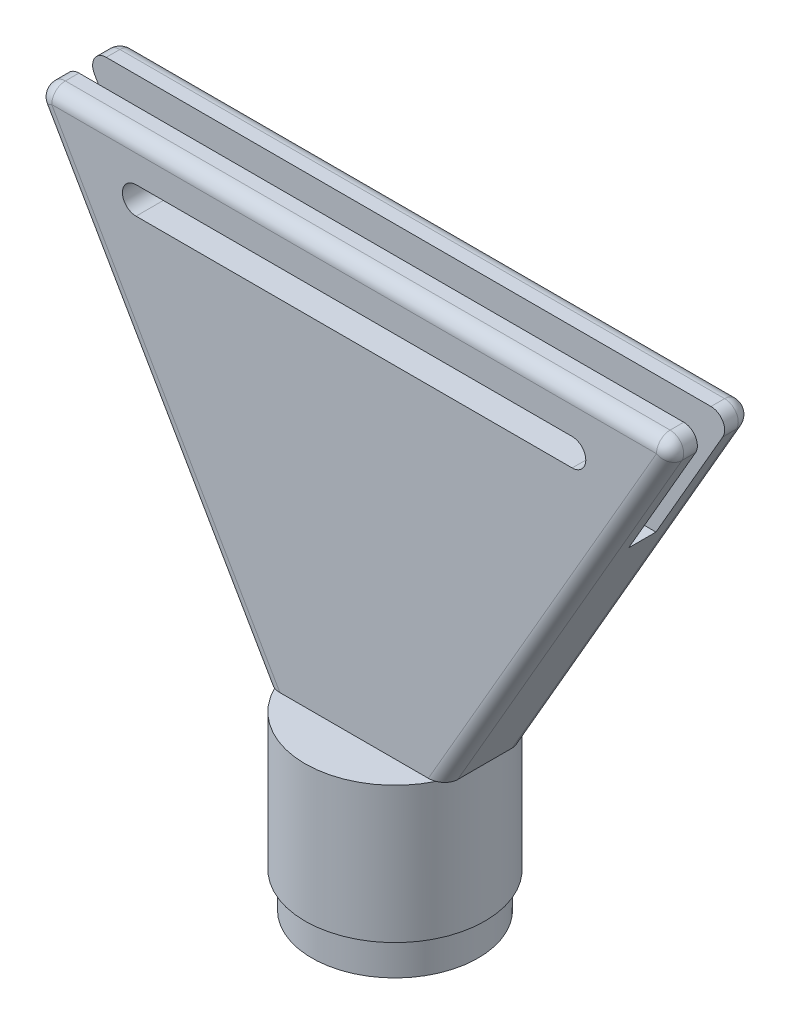
ISO-10303-21;
HEADER;
FILE_DESCRIPTION(('STEP AP214'),'2;1');
FILE_NAME('part.step','',(''),(''),'','','');
FILE_SCHEMA(('AUTOMOTIVE_DESIGN { 1 0 10303 214 1 1 1 1 }'));
ENDSEC;
DATA;
#1=APPLICATION_CONTEXT('core data for automotive mechanical design processes');
#2=APPLICATION_PROTOCOL_DEFINITION('international standard','automotive_design',2000,#1);
#3=PRODUCT_CONTEXT('',#1,'mechanical');
#4=PRODUCT('Part','Part','',(#3));
#5=PRODUCT_RELATED_PRODUCT_CATEGORY('part','',(#4));
#6=PRODUCT_DEFINITION_FORMATION('','',#4);
#7=PRODUCT_DEFINITION_CONTEXT('part definition',#1,'design');
#8=PRODUCT_DEFINITION('design','',#6,#7);
#9=PRODUCT_DEFINITION_SHAPE('','',#8);
#10=(LENGTH_UNIT() NAMED_UNIT(*) SI_UNIT(.MILLI.,.METRE.));
#11=(NAMED_UNIT(*) PLANE_ANGLE_UNIT() SI_UNIT($,.RADIAN.));
#12=(NAMED_UNIT(*) SI_UNIT($,.STERADIAN.) SOLID_ANGLE_UNIT());
#13=UNCERTAINTY_MEASURE_WITH_UNIT(LENGTH_MEASURE(1.E-05),#10,'distance_accuracy_value','');
#14=(GEOMETRIC_REPRESENTATION_CONTEXT(3) GLOBAL_UNCERTAINTY_ASSIGNED_CONTEXT((#13)) GLOBAL_UNIT_ASSIGNED_CONTEXT((#10,
#11,#12)) REPRESENTATION_CONTEXT('',''));
#15=CARTESIAN_POINT('',(0.,0.,0.));
#16=DIRECTION('',(0.,0.,1.));
#17=DIRECTION('',(1.,0.,0.));
#18=AXIS2_PLACEMENT_3D('',#15,#16,#17);
#19=CARTESIAN_POINT('',(60.7580905122492,108.204,7.62));
#20=DIRECTION('',(0.,-1.,0.));
#21=DIRECTION('',(0.,0.,-1.));
#22=AXIS2_PLACEMENT_3D('',#19,#20,#21);
#23=PLANE('',#22);
#24=DIRECTION('',(0.,0.,-1.));
#25=VECTOR('',#24,1.);
#26=CARTESIAN_POINT('',(56.3586814610243,108.204,7.62));
#27=LINE('',#26,#25);
#28=CARTESIAN_POINT('',(56.3586814610243,108.204,5.08));
#29=VERTEX_POINT('',#28);
#30=CARTESIAN_POINT('',(56.3586814610243,108.204,2.54));
#31=VERTEX_POINT('',#30);
#32=EDGE_CURVE('E332',#29,#31,#27,.T.);
#33=ORIENTED_EDGE('',*,*,#32,.T.);
#34=DIRECTION('',(1.,0.,0.));
#35=VECTOR('',#34,1.);
#36=CARTESIAN_POINT('',(-58.8986814610243,108.204,2.54));
#37=LINE('',#36,#35);
#38=CARTESIAN_POINT('',(-56.3586814610243,108.204,2.54));
#39=VERTEX_POINT('',#38);
#40=EDGE_CURVE('E273',#39,#31,#37,.T.);
#41=ORIENTED_EDGE('',*,*,#40,.F.);
#42=DIRECTION('',(0.,0.,-1.));
#43=VECTOR('',#42,1.);
#44=CARTESIAN_POINT('',(-56.3586814610243,108.204,7.62));
#45=LINE('',#44,#43);
#46=CARTESIAN_POINT('',(-56.3586814610243,108.204,5.08));
#47=VERTEX_POINT('',#46);
#48=EDGE_CURVE('E327',#39,#47,#45,.F.);
#49=ORIENTED_EDGE('',*,*,#48,.T.);
#50=DIRECTION('',(-1.,0.,0.));
#51=VECTOR('',#50,1.);
#52=CARTESIAN_POINT('',(60.7580905122492,108.204,5.08));
#53=LINE('',#52,#51);
#54=EDGE_CURVE('E335',#47,#29,#53,.F.);
#55=ORIENTED_EDGE('',*,*,#54,.T.);
#56=EDGE_LOOP('',(#33,#41,#49,#55));
#57=FACE_BOUND('',#56,.T.);
#58=ADVANCED_FACE('F34',(#57),#23,.F.);
#59=CARTESIAN_POINT('',(-56.3586814610243,105.664,7.62));
#60=DIRECTION('',(0.,0.,-1.));
#61=DIRECTION('',(-1.,0.,0.));
#62=AXIS2_PLACEMENT_3D('',#59,#60,#61);
#63=CYLINDRICAL_SURFACE('',#62,2.54);
#64=CARTESIAN_POINT('',(-56.3586814610243,105.664,2.54));
#65=DIRECTION('',(0.,0.,1.));
#66=DIRECTION('',(1.,0.,0.));
#67=AXIS2_PLACEMENT_3D('',#64,#65,#66);
#68=CIRCLE('',#67,2.54);
#69=CARTESIAN_POINT('',(-58.5583859866368,104.394,2.54));
#70=VERTEX_POINT('',#69);
#71=EDGE_CURVE('E289',#70,#39,#68,.F.);
#72=ORIENTED_EDGE('',*,*,#71,.F.);
#73=DIRECTION('',(0.,0.,-1.));
#74=VECTOR('',#73,1.);
#75=CARTESIAN_POINT('',(-58.5583859866368,104.394,7.62));
#76=LINE('',#75,#74);
#77=CARTESIAN_POINT('',(-58.5583859866368,104.394,5.08));
#78=VERTEX_POINT('',#77);
#79=EDGE_CURVE('E348',#78,#70,#76,.T.);
#80=ORIENTED_EDGE('',*,*,#79,.F.);
#81=CARTESIAN_POINT('',(-56.3586814610243,105.664,5.08));
#82=DIRECTION('',(0.,0.,1.));
#83=DIRECTION('',(1.,0.,0.));
#84=AXIS2_PLACEMENT_3D('',#81,#82,#83);
#85=CIRCLE('',#84,2.54);
#86=EDGE_CURVE('E415',#47,#78,#85,.T.);
#87=ORIENTED_EDGE('',*,*,#86,.F.);
#88=ORIENTED_EDGE('',*,*,#48,.F.);
#89=EDGE_LOOP('',(#72,#80,#87,#88));
#90=FACE_BOUND('',#89,.T.);
#91=ADVANCED_FACE('F449',(#90),#63,.T.);
#92=CARTESIAN_POINT('',(56.3586814610243,105.664,7.62));
#93=DIRECTION('',(0.,0.,-1.));
#94=DIRECTION('',(-1.,0.,0.));
#95=AXIS2_PLACEMENT_3D('',#92,#93,#94);
#96=CYLINDRICAL_SURFACE('',#95,2.54);
#97=DIRECTION('',(0.,0.,-1.));
#98=VECTOR('',#97,1.);
#99=CARTESIAN_POINT('',(58.5583859866368,104.394,7.62));
#100=LINE('',#99,#98);
#101=CARTESIAN_POINT('',(58.5583859866368,104.394,2.54));
#102=VERTEX_POINT('',#101);
#103=CARTESIAN_POINT('',(58.5583859866368,104.394,5.08));
#104=VERTEX_POINT('',#103);
#105=EDGE_CURVE('E339',#102,#104,#100,.F.);
#106=ORIENTED_EDGE('',*,*,#105,.F.);
#107=CARTESIAN_POINT('',(56.3586814610243,105.664,2.54));
#108=DIRECTION('',(0.,0.,1.));
#109=DIRECTION('',(1.,0.,0.));
#110=AXIS2_PLACEMENT_3D('',#107,#108,#109);
#111=CIRCLE('',#110,2.54);
#112=EDGE_CURVE('E422',#31,#102,#111,.F.);
#113=ORIENTED_EDGE('',*,*,#112,.F.);
#114=ORIENTED_EDGE('',*,*,#32,.F.);
#115=CARTESIAN_POINT('',(56.3586814610243,105.664,5.08));
#116=DIRECTION('',(0.,0.,1.));
#117=DIRECTION('',(1.,0.,0.));
#118=AXIS2_PLACEMENT_3D('',#115,#116,#117);
#119=CIRCLE('',#118,2.54);
#120=EDGE_CURVE('E388',#29,#104,#119,.F.);
#121=ORIENTED_EDGE('',*,*,#120,.T.);
#122=EDGE_LOOP('',(#106,#113,#114,#121));
#123=FACE_BOUND('',#122,.T.);
#124=ADVANCED_FACE('F456',(#123),#96,.T.);
#125=CARTESIAN_POINT('',(0.,32.004,0.));
#126=DIRECTION('',(0.,1.,0.));
#127=DIRECTION('',(0.,0.,1.));
#128=AXIS2_PLACEMENT_3D('',#125,#126,#127);
#129=PLANE('',#128);
#130=CARTESIAN_POINT('',(0.,32.004,0.));
#131=DIRECTION('',(0.,1.,0.));
#132=DIRECTION('',(0.,0.,1.));
#133=AXIS2_PLACEMENT_3D('',#130,#131,#132);
#134=CIRCLE('',#133,16.764);
#135=CARTESIAN_POINT('',(15.0464319536251,32.004,-7.39165620581253));
#136=VERTEX_POINT('',#135);
#137=CARTESIAN_POINT('',(-15.0464319536246,32.004,-7.39165620581371));
#138=VERTEX_POINT('',#137);
#139=EDGE_CURVE('E501',#136,#138,#134,.T.);
#140=ORIENTED_EDGE('',*,*,#139,.T.);
#141=CARTESIAN_POINT('',(-13.8310606325167,32.004,-5.08));
#142=DIRECTION('',(0.,1.,0.));
#143=DIRECTION('',(1.,0.,0.));
#144=AXIS2_PLACEMENT_3D('',#141,#142,#143);
#145=ELLIPSE('',#144,2.93293936748329,2.54);
#146=CARTESIAN_POINT('',(-13.8310606325167,32.004,-7.62));
#147=VERTEX_POINT('',#146);
#148=EDGE_CURVE('E378',#138,#147,#145,.F.);
#149=ORIENTED_EDGE('',*,*,#148,.T.);
#150=DIRECTION('',(1.,0.,0.));
#151=VECTOR('',#150,1.);
#152=CARTESIAN_POINT('',(-16.764,32.004,-7.62));
#153=LINE('',#152,#151);
#154=CARTESIAN_POINT('',(13.8310606325167,32.004,-7.62));
#155=VERTEX_POINT('',#154);
#156=EDGE_CURVE('E300',#147,#155,#153,.T.);
#157=ORIENTED_EDGE('',*,*,#156,.T.);
#158=CARTESIAN_POINT('',(13.8310606325167,32.004,-5.08));
#159=DIRECTION('',(0.,1.,0.));
#160=DIRECTION('',(1.,0.,0.));
#161=AXIS2_PLACEMENT_3D('',#158,#159,#160);
#162=ELLIPSE('',#161,2.93293936748329,2.54);
#163=EDGE_CURVE('E382',#155,#136,#162,.F.);
#164=ORIENTED_EDGE('',*,*,#163,.T.);
#165=EDGE_LOOP('',(#140,#149,#157,#164));
#166=FACE_BOUND('',#165,.T.);
#167=ADVANCED_FACE('F500',(#166),#129,.T.);
#168=CARTESIAN_POINT('',(0.,6.604,0.));
#169=DIRECTION('',(0.,-1.,0.));
#170=DIRECTION('',(0.,0.,-1.));
#171=AXIS2_PLACEMENT_3D('',#168,#169,#170);
#172=CYLINDRICAL_SURFACE('',#171,15.494);
#173=CARTESIAN_POINT('',(0.,6.604,0.));
#174=DIRECTION('',(0.,1.,0.));
#175=DIRECTION('',(0.,0.,1.));
#176=AXIS2_PLACEMENT_3D('',#173,#174,#175);
#177=CIRCLE('',#176,15.494);
#178=CARTESIAN_POINT('',(0.,6.604,-15.494));
#179=VERTEX_POINT('',#178);
#180=EDGE_CURVE('E301',#179,#179,#177,.T.);
#181=CARTESIAN_POINT('',(0.,0.,0.));
#182=DIRECTION('',(0.,1.,0.));
#183=DIRECTION('',(0.,0.,1.));
#184=AXIS2_PLACEMENT_3D('',#181,#182,#183);
#185=CIRCLE('',#184,15.494);
#186=CARTESIAN_POINT('',(0.,0.,-15.494));
#187=VERTEX_POINT('',#186);
#188=EDGE_CURVE('E316',#187,#187,#185,.T.);
#189=CARTESIAN_POINT('',(0.,6.604,-15.494));
#190=CARTESIAN_POINT('',(0.,6.53520833333333,-15.494));
#191=CARTESIAN_POINT('',(0.,6.46641666666667,-15.494));
#192=CARTESIAN_POINT('',(0.,6.32883333333333,-15.494));
#193=CARTESIAN_POINT('',(0.,6.26004166666667,-15.494));
#194=CARTESIAN_POINT('',(0.,6.12245833333333,-15.494));
#195=CARTESIAN_POINT('',(0.,6.05366666666667,-15.494));
#196=CARTESIAN_POINT('',(0.,5.91608333333333,-15.494));
#197=CARTESIAN_POINT('',(0.,5.84729166666667,-15.494));
#198=CARTESIAN_POINT('',(0.,5.70970833333333,-15.494));
#199=CARTESIAN_POINT('',(0.,5.64091666666667,-15.494));
#200=CARTESIAN_POINT('',(0.,5.50333333333333,-15.494));
#201=CARTESIAN_POINT('',(0.,5.43454166666667,-15.494));
#202=CARTESIAN_POINT('',(0.,5.29695833333333,-15.494));
#203=CARTESIAN_POINT('',(0.,5.22816666666667,-15.494));
#204=CARTESIAN_POINT('',(0.,5.09058333333333,-15.494));
#205=CARTESIAN_POINT('',(0.,5.02179166666667,-15.494));
#206=CARTESIAN_POINT('',(0.,4.88420833333333,-15.494));
#207=CARTESIAN_POINT('',(0.,4.81541666666667,-15.494));
#208=CARTESIAN_POINT('',(0.,4.67783333333333,-15.494));
#209=CARTESIAN_POINT('',(0.,4.60904166666667,-15.494));
#210=CARTESIAN_POINT('',(0.,4.47145833333333,-15.494));
#211=CARTESIAN_POINT('',(0.,4.40266666666667,-15.494));
#212=CARTESIAN_POINT('',(0.,4.26508333333333,-15.494));
#213=CARTESIAN_POINT('',(0.,4.19629166666667,-15.494));
#214=CARTESIAN_POINT('',(0.,4.05870833333333,-15.494));
#215=CARTESIAN_POINT('',(0.,3.98991666666667,-15.494));
#216=CARTESIAN_POINT('',(0.,3.85233333333333,-15.494));
#217=CARTESIAN_POINT('',(0.,3.78354166666667,-15.494));
#218=CARTESIAN_POINT('',(0.,3.64595833333333,-15.494));
#219=CARTESIAN_POINT('',(0.,3.57716666666667,-15.494));
#220=CARTESIAN_POINT('',(0.,3.43958333333333,-15.494));
#221=CARTESIAN_POINT('',(0.,3.37079166666667,-15.494));
#222=CARTESIAN_POINT('',(0.,3.23320833333333,-15.494));
#223=CARTESIAN_POINT('',(0.,3.16441666666667,-15.494));
#224=CARTESIAN_POINT('',(0.,3.02683333333333,-15.494));
#225=CARTESIAN_POINT('',(0.,2.95804166666667,-15.494));
#226=CARTESIAN_POINT('',(0.,2.82045833333333,-15.494));
#227=CARTESIAN_POINT('',(0.,2.75166666666667,-15.494));
#228=CARTESIAN_POINT('',(0.,2.61408333333333,-15.494));
#229=CARTESIAN_POINT('',(0.,2.54529166666667,-15.494));
#230=CARTESIAN_POINT('',(0.,2.40770833333333,-15.494));
#231=CARTESIAN_POINT('',(0.,2.33891666666667,-15.494));
#232=CARTESIAN_POINT('',(0.,2.20133333333333,-15.494));
#233=CARTESIAN_POINT('',(0.,2.13254166666667,-15.494));
#234=CARTESIAN_POINT('',(0.,1.99495833333333,-15.494));
#235=CARTESIAN_POINT('',(0.,1.92616666666667,-15.494));
#236=CARTESIAN_POINT('',(0.,1.78858333333333,-15.494));
#237=CARTESIAN_POINT('',(0.,1.71979166666667,-15.494));
#238=CARTESIAN_POINT('',(0.,1.58220833333333,-15.494));
#239=CARTESIAN_POINT('',(0.,1.51341666666667,-15.494));
#240=CARTESIAN_POINT('',(0.,1.37583333333333,-15.494));
#241=CARTESIAN_POINT('',(0.,1.30704166666667,-15.494));
#242=CARTESIAN_POINT('',(0.,1.16945833333333,-15.494));
#243=CARTESIAN_POINT('',(0.,1.10066666666667,-15.494));
#244=CARTESIAN_POINT('',(0.,0.963083333333333,-15.494));
#245=CARTESIAN_POINT('',(0.,0.894291666666666,-15.494));
#246=CARTESIAN_POINT('',(0.,0.756708333333333,-15.494));
#247=CARTESIAN_POINT('',(0.,0.687916666666667,-15.494));
#248=CARTESIAN_POINT('',(0.,0.550333333333333,-15.494));
#249=CARTESIAN_POINT('',(0.,0.481541666666667,-15.494));
#250=CARTESIAN_POINT('',(0.,0.343958333333333,-15.494));
#251=CARTESIAN_POINT('',(0.,0.275166666666667,-15.494));
#252=CARTESIAN_POINT('',(0.,0.137583333333333,-15.494));
#253=CARTESIAN_POINT('',(0.,0.0687916666666666,-15.494));
#254=CARTESIAN_POINT('',(0.,0.,-15.494));
#255=B_SPLINE_CURVE_WITH_KNOTS('',3,(#189,#190,#191,#192,#193,#194,#195,#196,#197,#198,#199,
#200,#201,#202,#203,#204,#205,#206,#207,#208,#209,#210,#211,#212,#213,#214,#215,#216,#217,#218,
#219,#220,#221,#222,#223,#224,#225,#226,#227,#228,#229,#230,#231,#232,#233,#234,#235,#236,#237,
#238,#239,#240,#241,#242,#243,#244,#245,#246,#247,#248,#249,#250,#251,#252,#253,#254),
.UNSPECIFIED.,.F.,.F.,(4,2,2,2,2,2,2,2,2,2,2,2,2,2,2,2,2,2,2,2,2,2,2,2,2,2,2,2,2,2,2,2,4),(0.,
0.206375,0.41275,0.619125,0.8255,1.031875,1.23825,1.444625,1.651,1.857375,2.06375,2.270125,
2.4765,2.682875,2.88925,3.095625,3.302,3.508375,3.71475,3.921125,4.1275,4.333875,4.54025,
4.746625,4.953,5.159375,5.36575,5.572125,5.7785,5.984875,6.19125,6.397625,6.604),.UNSPECIFIED.);
#256=EDGE_CURVE('BSEAM835',#179,#187,#255,.T.);
#257=ORIENTED_EDGE('',*,*,#180,.F.);
#258=ORIENTED_EDGE('',*,*,#188,.T.);
#259=ORIENTED_EDGE('',*,*,#256,.T.);
#260=ORIENTED_EDGE('',*,*,#256,.F.);
#261=EDGE_LOOP('',(#257,#259,#258,#260));
#262=FACE_BOUND('',#261,.T.);
#263=ADVANCED_FACE('F835',(#262),#172,.T.);
#264=CARTESIAN_POINT('',(0.,0.,0.));
#265=DIRECTION('',(0.,1.,0.));
#266=DIRECTION('',(0.,0.,1.));
#267=AXIS2_PLACEMENT_3D('',#264,#265,#266);
#268=PLANE('',#267);
#269=ORIENTED_EDGE('',*,*,#188,.F.);
#270=EDGE_LOOP('',(#269));
#271=FACE_BOUND('',#270,.T.);
#272=ADVANCED_FACE('F857',(#271),#268,.F.);
#273=CARTESIAN_POINT('',(0.,32.004,0.));
#274=DIRECTION('',(0.,-1.,0.));
#275=DIRECTION('',(0.,0.,-1.));
#276=AXIS2_PLACEMENT_3D('',#273,#274,#275);
#277=CYLINDRICAL_SURFACE('',#276,16.764);
#278=CARTESIAN_POINT('',(15.0464319536249,32.004,7.39165620581315));
#279=VERTEX_POINT('',#278);
#280=CARTESIAN_POINT('',(16.764,32.004,0.));
#281=VERTEX_POINT('',#280);
#282=EDGE_CURVE('E314',#279,#281,#134,.T.);
#283=ORIENTED_EDGE('',*,*,#282,.F.);
#284=CARTESIAN_POINT('',(-15.0464319536257,32.004,7.39165620581158));
#285=VERTEX_POINT('',#284);
#286=EDGE_CURVE('E321',#285,#279,#134,.T.);
#287=ORIENTED_EDGE('',*,*,#286,.F.);
#288=CARTESIAN_POINT('',(-16.764,32.004,0.));
#289=VERTEX_POINT('',#288);
#290=EDGE_CURVE('E515',#289,#285,#134,.T.);
#291=ORIENTED_EDGE('',*,*,#290,.F.);
#292=EDGE_CURVE('E318',#138,#289,#134,.T.);
#293=ORIENTED_EDGE('',*,*,#292,.F.);
#294=ORIENTED_EDGE('',*,*,#139,.F.);
#295=EDGE_CURVE('E317',#281,#136,#134,.T.);
#296=ORIENTED_EDGE('',*,*,#295,.F.);
#297=EDGE_LOOP('',(#283,#287,#291,#293,#294,#296));
#298=FACE_BOUND('',#297,.T.);
#299=CARTESIAN_POINT('',(0.,6.604,0.));
#300=DIRECTION('',(0.,1.,0.));
#301=DIRECTION('',(0.,0.,1.));
#302=AXIS2_PLACEMENT_3D('',#299,#300,#301);
#303=CIRCLE('',#302,16.764);
#304=CARTESIAN_POINT('',(0.,6.604,16.764));
#305=VERTEX_POINT('',#304);
#306=EDGE_CURVE('E313',#305,#305,#303,.T.);
#307=ORIENTED_EDGE('',*,*,#306,.T.);
#308=EDGE_LOOP('',(#307));
#309=FACE_BOUND('',#308,.T.);
#310=ADVANCED_FACE('F521',(#298,#309),#277,.T.);
#311=DIRECTION('',(1.,0.,0.));
#312=VECTOR('',#311,1.);
#313=CARTESIAN_POINT('',(-16.764,32.004,7.62));
#314=LINE('',#313,#312);
#315=CARTESIAN_POINT('',(-13.8310606325167,32.004,7.62));
#316=VERTEX_POINT('',#315);
#317=CARTESIAN_POINT('',(13.8310606325167,32.004,7.62));
#318=VERTEX_POINT('',#317);
#319=EDGE_CURVE('E297',#316,#318,#314,.T.);
#320=ORIENTED_EDGE('',*,*,#319,.F.);
#321=CARTESIAN_POINT('',(-13.8310606325167,32.004,5.08));
#322=DIRECTION('',(0.,1.,0.));
#323=DIRECTION('',(-1.,0.,0.));
#324=AXIS2_PLACEMENT_3D('',#321,#322,#323);
#325=ELLIPSE('',#324,2.93293936748329,2.54);
#326=EDGE_CURVE('E375',#316,#285,#325,.F.);
#327=ORIENTED_EDGE('',*,*,#326,.T.);
#328=ORIENTED_EDGE('',*,*,#286,.T.);
#329=CARTESIAN_POINT('',(13.8310606325167,32.004,5.08));
#330=DIRECTION('',(0.,1.,0.));
#331=DIRECTION('',(-1.,0.,0.));
#332=AXIS2_PLACEMENT_3D('',#329,#330,#331);
#333=ELLIPSE('',#332,2.93293936748329,2.54);
#334=EDGE_CURVE('E380',#279,#318,#333,.F.);
#335=ORIENTED_EDGE('',*,*,#334,.T.);
#336=EDGE_LOOP('',(#320,#327,#328,#335));
#337=FACE_BOUND('',#336,.T.);
#338=ADVANCED_FACE('F540',(#337),#129,.T.);
#339=CARTESIAN_POINT('',(0.,6.604,0.));
#340=DIRECTION('',(0.,1.,0.));
#341=DIRECTION('',(0.,0.,1.));
#342=AXIS2_PLACEMENT_3D('',#339,#340,#341);
#343=PLANE('',#342);
#344=ORIENTED_EDGE('',*,*,#180,.T.);
#345=EDGE_LOOP('',(#344));
#346=FACE_BOUND('',#345,.T.);
#347=ORIENTED_EDGE('',*,*,#306,.F.);
#348=EDGE_LOOP('',(#347));
#349=FACE_BOUND('',#348,.T.);
#350=ADVANCED_FACE('F827',(#346,#349),#343,.F.);
#351=CARTESIAN_POINT('',(-16.764,32.004,7.62));
#352=DIRECTION('',(0.,1.,0.));
#353=DIRECTION('',(0.,0.,1.));
#354=AXIS2_PLACEMENT_3D('',#351,#352,#353);
#355=PLANE('',#354);
#356=DIRECTION('',(0.,0.,-1.));
#357=VECTOR('',#356,1.);
#358=CARTESIAN_POINT('',(16.764,32.004,7.62));
#359=LINE('',#358,#357);
#360=CARTESIAN_POINT('',(16.764,32.004,5.08));
#361=VERTEX_POINT('',#360);
#362=EDGE_CURVE('E310',#361,#281,#359,.T.);
#363=ORIENTED_EDGE('',*,*,#362,.F.);
#364=CARTESIAN_POINT('',(13.8310606325167,32.004,5.08));
#365=DIRECTION('',(0.,1.,0.));
#366=DIRECTION('',(-1.,0.,0.));
#367=AXIS2_PLACEMENT_3D('',#364,#365,#366);
#368=ELLIPSE('',#367,2.9329393674833,2.54);
#369=EDGE_CURVE('E370',#361,#279,#368,.F.);
#370=ORIENTED_EDGE('',*,*,#369,.T.);
#371=ORIENTED_EDGE('',*,*,#282,.T.);
#372=EDGE_LOOP('',(#363,#370,#371));
#373=FACE_BOUND('',#372,.T.);
#374=ADVANCED_FACE('F808',(#373),#355,.F.);
#375=ORIENTED_EDGE('',*,*,#295,.T.);
#376=CARTESIAN_POINT('',(13.8310606325167,32.004,-5.08));
#377=DIRECTION('',(0.,1.,0.));
#378=DIRECTION('',(1.,0.,0.));
#379=AXIS2_PLACEMENT_3D('',#376,#377,#378);
#380=ELLIPSE('',#379,2.9329393674833,2.54);
#381=CARTESIAN_POINT('',(16.764,32.004,-5.08));
#382=VERTEX_POINT('',#381);
#383=EDGE_CURVE('E373',#136,#382,#380,.F.);
#384=ORIENTED_EDGE('',*,*,#383,.T.);
#385=EDGE_CURVE('E308',#281,#382,#359,.T.);
#386=ORIENTED_EDGE('',*,*,#385,.F.);
#387=EDGE_LOOP('',(#375,#384,#386));
#388=FACE_BOUND('',#387,.T.);
#389=ADVANCED_FACE('F527',(#388),#355,.F.);
#390=DIRECTION('',(0.,0.,-1.));
#391=VECTOR('',#390,1.);
#392=CARTESIAN_POINT('',(-16.764,32.004,7.62));
#393=LINE('',#392,#391);
#394=CARTESIAN_POINT('',(-16.764,32.004,-5.08));
#395=VERTEX_POINT('',#394);
#396=EDGE_CURVE('E309',#289,#395,#393,.T.);
#397=ORIENTED_EDGE('',*,*,#396,.T.);
#398=CARTESIAN_POINT('',(-13.8310606325167,32.004,-5.08));
#399=DIRECTION('',(0.,1.,0.));
#400=DIRECTION('',(1.,0.,0.));
#401=AXIS2_PLACEMENT_3D('',#398,#399,#400);
#402=ELLIPSE('',#401,2.9329393674833,2.54);
#403=EDGE_CURVE('E367',#395,#138,#402,.F.);
#404=ORIENTED_EDGE('',*,*,#403,.T.);
#405=ORIENTED_EDGE('',*,*,#292,.T.);
#406=EDGE_LOOP('',(#397,#404,#405));
#407=FACE_BOUND('',#406,.T.);
#408=ADVANCED_FACE('F511',(#407),#355,.F.);
#409=ORIENTED_EDGE('',*,*,#290,.T.);
#410=CARTESIAN_POINT('',(-13.8310606325167,32.004,5.08));
#411=DIRECTION('',(0.,1.,0.));
#412=DIRECTION('',(-1.,0.,0.));
#413=AXIS2_PLACEMENT_3D('',#410,#411,#412);
#414=ELLIPSE('',#413,2.9329393674833,2.54);
#415=CARTESIAN_POINT('',(-16.764,32.004,5.08));
#416=VERTEX_POINT('',#415);
#417=EDGE_CURVE('E365',#285,#416,#414,.F.);
#418=ORIENTED_EDGE('',*,*,#417,.T.);
#419=EDGE_CURVE('E305',#416,#289,#393,.T.);
#420=ORIENTED_EDGE('',*,*,#419,.T.);
#421=EDGE_LOOP('',(#409,#418,#420));
#422=FACE_BOUND('',#421,.T.);
#423=ADVANCED_FACE('F471',(#422),#355,.F.);
#424=CARTESIAN_POINT('',(16.764,32.004,7.62));
#425=DIRECTION('',(-0.86602540378444,0.499999999999998,0.));
#426=DIRECTION('',(-0.499999999999998,-0.86602540378444,0.));
#427=AXIS2_PLACEMENT_3D('',#424,#425,#426);
#428=PLANE('',#427);
#429=DIRECTION('',(0.,0.,-1.));
#430=VECTOR('',#429,1.);
#431=CARTESIAN_POINT('',(46.0933936748328,82.804,7.62));
#432=LINE('',#431,#430);
#433=CARTESIAN_POINT('',(46.0933936748328,82.804,2.54));
#434=VERTEX_POINT('',#433);
#435=CARTESIAN_POINT('',(46.0933936748328,82.804,-2.54));
#436=VERTEX_POINT('',#435);
#437=EDGE_CURVE('E294',#434,#436,#432,.T.);
#438=ORIENTED_EDGE('',*,*,#437,.F.);
#439=DIRECTION('',(0.499999999999998,0.86602540378444,0.));
#440=VECTOR('',#439,1.);
#441=CARTESIAN_POINT('',(16.764,32.004,2.54));
#442=LINE('',#441,#440);
#443=EDGE_CURVE('E286',#434,#102,#442,.T.);
#444=ORIENTED_EDGE('',*,*,#443,.T.);
#445=ORIENTED_EDGE('',*,*,#105,.T.);
#446=DIRECTION('',(0.499999999999998,0.86602540378444,0.));
#447=VECTOR('',#446,1.);
#448=CARTESIAN_POINT('',(16.764,32.004,5.08));
#449=LINE('',#448,#447);
#450=EDGE_CURVE('E343',#104,#361,#449,.F.);
#451=ORIENTED_EDGE('',*,*,#450,.T.);
#452=ORIENTED_EDGE('',*,*,#362,.T.);
#453=ORIENTED_EDGE('',*,*,#385,.T.);
#454=DIRECTION('',(0.499999999999998,0.86602540378444,0.));
#455=VECTOR('',#454,1.);
#456=CARTESIAN_POINT('',(16.764,32.004,-5.08));
#457=LINE('',#456,#455);
#458=CARTESIAN_POINT('',(58.5583859866368,104.394,-5.08));
#459=VERTEX_POINT('',#458);
#460=EDGE_CURVE('E337',#382,#459,#457,.T.);
#461=ORIENTED_EDGE('',*,*,#460,.T.);
#462=CARTESIAN_POINT('',(58.5583859866368,104.394,-2.54));
#463=VERTEX_POINT('',#462);
#464=EDGE_CURVE('E340',#459,#463,#100,.F.);
#465=ORIENTED_EDGE('',*,*,#464,.T.);
#466=DIRECTION('',(-0.499999999999998,-0.86602540378444,0.));
#467=VECTOR('',#466,1.);
#468=CARTESIAN_POINT('',(16.764,32.004,-2.54));
#469=LINE('',#468,#467);
#470=EDGE_CURVE('E276',#463,#436,#469,.T.);
#471=ORIENTED_EDGE('',*,*,#470,.T.);
#472=EDGE_LOOP('',(#438,#444,#445,#451,#452,#453,#461,#465,#471));
#473=FACE_BOUND('',#472,.T.);
#474=ADVANCED_FACE('F463',(#473),#428,.F.);
#475=CARTESIAN_POINT('',(-56.3586814610243,108.204,-5.08));
#476=VERTEX_POINT('',#475);
#477=CARTESIAN_POINT('',(-56.3586814610243,108.204,-2.54));
#478=VERTEX_POINT('',#477);
#479=EDGE_CURVE('E328',#476,#478,#45,.F.);
#480=ORIENTED_EDGE('',*,*,#479,.T.);
#481=DIRECTION('',(-1.,0.,0.));
#482=VECTOR('',#481,1.);
#483=CARTESIAN_POINT('',(-58.8986814610243,108.204,-2.54));
#484=LINE('',#483,#482);
#485=CARTESIAN_POINT('',(56.3586814610243,108.204,-2.54));
#486=VERTEX_POINT('',#485);
#487=EDGE_CURVE('E268',#486,#478,#484,.T.);
#488=ORIENTED_EDGE('',*,*,#487,.F.);
#489=CARTESIAN_POINT('',(56.3586814610243,108.204,-5.08));
#490=VERTEX_POINT('',#489);
#491=EDGE_CURVE('E331',#486,#490,#27,.T.);
#492=ORIENTED_EDGE('',*,*,#491,.T.);
#493=DIRECTION('',(-1.,0.,0.));
#494=VECTOR('',#493,1.);
#495=CARTESIAN_POINT('',(60.7580905122492,108.204,-5.08));
#496=LINE('',#495,#494);
#497=EDGE_CURVE('E304',#490,#476,#496,.T.);
#498=ORIENTED_EDGE('',*,*,#497,.T.);
#499=EDGE_LOOP('',(#480,#488,#492,#498));
#500=FACE_BOUND('',#499,.T.);
#501=ADVANCED_FACE('F452',(#500),#23,.F.);
#502=CARTESIAN_POINT('',(-16.764,32.004,7.62));
#503=DIRECTION('',(0.86602540378444,0.499999999999998,0.));
#504=DIRECTION('',(-0.499999999999998,0.86602540378444,0.));
#505=AXIS2_PLACEMENT_3D('',#502,#503,#504);
#506=PLANE('',#505);
#507=ORIENTED_EDGE('',*,*,#79,.T.);
#508=DIRECTION('',(0.499999999999998,-0.86602540378444,0.));
#509=VECTOR('',#508,1.);
#510=CARTESIAN_POINT('',(-16.764,32.004,2.54));
#511=LINE('',#510,#509);
#512=CARTESIAN_POINT('',(-46.0933936748328,82.804,2.54));
#513=VERTEX_POINT('',#512);
#514=EDGE_CURVE('E291',#70,#513,#511,.T.);
#515=ORIENTED_EDGE('',*,*,#514,.T.);
#516=DIRECTION('',(0.,0.,1.));
#517=VECTOR('',#516,1.);
#518=CARTESIAN_POINT('',(-46.0933936748328,82.804,7.62));
#519=LINE('',#518,#517);
#520=CARTESIAN_POINT('',(-46.0933936748328,82.804,-2.54));
#521=VERTEX_POINT('',#520);
#522=EDGE_CURVE('E424',#521,#513,#519,.T.);
#523=ORIENTED_EDGE('',*,*,#522,.F.);
#524=DIRECTION('',(-0.499999999999998,0.86602540378444,0.));
#525=VECTOR('',#524,1.);
#526=CARTESIAN_POINT('',(-16.764,32.004,-2.54));
#527=LINE('',#526,#525);
#528=CARTESIAN_POINT('',(-58.5583859866368,104.394,-2.54));
#529=VERTEX_POINT('',#528);
#530=EDGE_CURVE('E283',#521,#529,#527,.T.);
#531=ORIENTED_EDGE('',*,*,#530,.T.);
#532=CARTESIAN_POINT('',(-58.5583859866368,104.394,-5.08));
#533=VERTEX_POINT('',#532);
#534=EDGE_CURVE('E347',#529,#533,#76,.T.);
#535=ORIENTED_EDGE('',*,*,#534,.T.);
#536=DIRECTION('',(0.499999999999998,-0.86602540378444,0.));
#537=VECTOR('',#536,1.);
#538=CARTESIAN_POINT('',(-16.764,32.004,-5.08));
#539=LINE('',#538,#537);
#540=EDGE_CURVE('E345',#533,#395,#539,.T.);
#541=ORIENTED_EDGE('',*,*,#540,.T.);
#542=ORIENTED_EDGE('',*,*,#396,.F.);
#543=ORIENTED_EDGE('',*,*,#419,.F.);
#544=DIRECTION('',(0.499999999999998,-0.86602540378444,0.));
#545=VECTOR('',#544,1.);
#546=CARTESIAN_POINT('',(-60.7580905122492,108.204,5.08));
#547=LINE('',#546,#545);
#548=EDGE_CURVE('E351',#416,#78,#547,.F.);
#549=ORIENTED_EDGE('',*,*,#548,.T.);
#550=EDGE_LOOP('',(#507,#515,#523,#531,#535,#541,#542,#543,#549));
#551=FACE_BOUND('',#550,.T.);
#552=ADVANCED_FACE('F462',(#551),#506,.F.);
#553=CARTESIAN_POINT('',(0.,0.,7.62));
#554=DIRECTION('',(0.,0.,1.));
#555=DIRECTION('',(1.,0.,0.));
#556=AXIS2_PLACEMENT_3D('',#553,#554,#555);
#557=PLANE('',#556);
#558=CARTESIAN_POINT('',(40.64,98.044,7.62));
#559=DIRECTION('',(0.,0.,1.));
#560=DIRECTION('',(1.,0.,0.));
#561=AXIS2_PLACEMENT_3D('',#558,#559,#560);
#562=CIRCLE('',#561,2.54);
#563=CARTESIAN_POINT('',(40.64,95.504,7.62));
#564=VERTEX_POINT('',#563);
#565=CARTESIAN_POINT('',(40.64,100.584,7.62));
#566=VERTEX_POINT('',#565);
#567=EDGE_CURVE('E266',#564,#566,#562,.T.);
#568=ORIENTED_EDGE('',*,*,#567,.F.);
#569=DIRECTION('',(1.,0.,0.));
#570=VECTOR('',#569,1.);
#571=CARTESIAN_POINT('',(0.,95.504,7.62));
#572=LINE('',#571,#570);
#573=CARTESIAN_POINT('',(-40.64,95.504,7.62));
#574=VERTEX_POINT('',#573);
#575=EDGE_CURVE('E251',#574,#564,#572,.T.);
#576=ORIENTED_EDGE('',*,*,#575,.F.);
#577=CARTESIAN_POINT('',(-40.64,98.044,7.62));
#578=DIRECTION('',(0.,0.,1.));
#579=DIRECTION('',(1.,0.,0.));
#580=AXIS2_PLACEMENT_3D('',#577,#578,#579);
#581=CIRCLE('',#580,2.54);
#582=CARTESIAN_POINT('',(-40.64,100.584,7.62));
#583=VERTEX_POINT('',#582);
#584=EDGE_CURVE('E256',#583,#574,#581,.T.);
#585=ORIENTED_EDGE('',*,*,#584,.F.);
#586=DIRECTION('',(-1.,0.,0.));
#587=VECTOR('',#586,1.);
#588=CARTESIAN_POINT('',(0.,100.584,7.62));
#589=LINE('',#588,#587);
#590=EDGE_CURVE('E261',#566,#583,#589,.T.);
#591=ORIENTED_EDGE('',*,*,#590,.F.);
#592=EDGE_LOOP('',(#568,#576,#585,#591));
#593=FACE_BOUND('',#592,.T.);
#594=DIRECTION('',(-1.,0.,0.));
#595=VECTOR('',#594,1.);
#596=CARTESIAN_POINT('',(-60.7580905122492,105.664,7.62));
#597=LINE('',#596,#595);
#598=CARTESIAN_POINT('',(56.3586814610243,105.664,7.62));
#599=VERTEX_POINT('',#598);
#600=CARTESIAN_POINT('',(-56.3586814610243,105.664,7.62));
#601=VERTEX_POINT('',#600);
#602=EDGE_CURVE('E355',#599,#601,#597,.T.);
#603=ORIENTED_EDGE('',*,*,#602,.T.);
#604=DIRECTION('',(0.499999999999998,-0.86602540378444,0.));
#605=VECTOR('',#604,1.);
#606=CARTESIAN_POINT('',(-14.5642954743875,33.274,7.62));
#607=LINE('',#606,#605);
#608=EDGE_CURVE('E357',#601,#316,#607,.T.);
#609=ORIENTED_EDGE('',*,*,#608,.T.);
#610=ORIENTED_EDGE('',*,*,#319,.T.);
#611=DIRECTION('',(0.499999999999998,0.86602540378444,0.));
#612=VECTOR('',#611,1.);
#613=CARTESIAN_POINT('',(58.5583859866368,109.474,7.62));
#614=LINE('',#613,#612);
#615=EDGE_CURVE('E353',#318,#599,#614,.T.);
#616=ORIENTED_EDGE('',*,*,#615,.T.);
#617=EDGE_LOOP('',(#603,#609,#610,#616));
#618=FACE_BOUND('',#617,.T.);
#619=ADVANCED_FACE('F469',(#593,#618),#557,.T.);
#620=CARTESIAN_POINT('',(0.,0.,-7.62));
#621=DIRECTION('',(0.,0.,1.));
#622=DIRECTION('',(1.,0.,0.));
#623=AXIS2_PLACEMENT_3D('',#620,#621,#622);
#624=PLANE('',#623);
#625=DIRECTION('',(-1.,0.,0.));
#626=VECTOR('',#625,1.);
#627=CARTESIAN_POINT('',(40.64,95.504,-7.62));
#628=LINE('',#627,#626);
#629=CARTESIAN_POINT('',(40.64,95.504,-7.62));
#630=VERTEX_POINT('',#629);
#631=CARTESIAN_POINT('',(-40.64,95.504,-7.62));
#632=VERTEX_POINT('',#631);
#633=EDGE_CURVE('E228',#630,#632,#628,.T.);
#634=ORIENTED_EDGE('',*,*,#633,.F.);
#635=CARTESIAN_POINT('',(40.64,98.044,-7.62));
#636=DIRECTION('',(0.,0.,-1.));
#637=DIRECTION('',(-1.,0.,0.));
#638=AXIS2_PLACEMENT_3D('',#635,#636,#637);
#639=CIRCLE('',#638,2.54);
#640=CARTESIAN_POINT('',(40.64,100.584,-7.62));
#641=VERTEX_POINT('',#640);
#642=EDGE_CURVE('E57',#641,#630,#639,.T.);
#643=ORIENTED_EDGE('',*,*,#642,.F.);
#644=DIRECTION('',(1.,0.,0.));
#645=VECTOR('',#644,1.);
#646=CARTESIAN_POINT('',(40.64,100.584,-7.62));
#647=LINE('',#646,#645);
#648=CARTESIAN_POINT('',(-40.64,100.584,-7.62));
#649=VERTEX_POINT('',#648);
#650=EDGE_CURVE('E236',#649,#641,#647,.T.);
#651=ORIENTED_EDGE('',*,*,#650,.F.);
#652=CARTESIAN_POINT('',(-40.64,98.044,-7.62));
#653=DIRECTION('',(0.,0.,-1.));
#654=DIRECTION('',(-1.,0.,0.));
#655=AXIS2_PLACEMENT_3D('',#652,#653,#654);
#656=CIRCLE('',#655,2.54);
#657=EDGE_CURVE('E219',#632,#649,#656,.T.);
#658=ORIENTED_EDGE('',*,*,#657,.F.);
#659=EDGE_LOOP('',(#634,#643,#651,#658));
#660=FACE_BOUND('',#659,.T.);
#661=ORIENTED_EDGE('',*,*,#156,.F.);
#662=DIRECTION('',(0.499999999999998,-0.86602540378444,0.));
#663=VECTOR('',#662,1.);
#664=CARTESIAN_POINT('',(3.48484303697098,2.01197506547878,-7.62));
#665=LINE('',#664,#663);
#666=CARTESIAN_POINT('',(-56.3586814610243,105.664,-7.62));
#667=VERTEX_POINT('',#666);
#668=EDGE_CURVE('E363',#147,#667,#665,.F.);
#669=ORIENTED_EDGE('',*,*,#668,.T.);
#670=DIRECTION('',(-1.,0.,0.));
#671=VECTOR('',#670,1.);
#672=CARTESIAN_POINT('',(0.,105.664,-7.62));
#673=LINE('',#672,#671);
#674=CARTESIAN_POINT('',(56.3586814610243,105.664,-7.62));
#675=VERTEX_POINT('',#674);
#676=EDGE_CURVE('E361',#667,#675,#673,.F.);
#677=ORIENTED_EDGE('',*,*,#676,.T.);
#678=DIRECTION('',(0.499999999999998,0.86602540378444,0.));
#679=VECTOR('',#678,1.);
#680=CARTESIAN_POINT('',(-3.48484303697099,2.01197506547878,-7.62));
#681=LINE('',#680,#679);
#682=EDGE_CURVE('E359',#675,#155,#681,.F.);
#683=ORIENTED_EDGE('',*,*,#682,.T.);
#684=EDGE_LOOP('',(#661,#669,#677,#683));
#685=FACE_BOUND('',#684,.T.);
#686=ADVANCED_FACE('F233',(#660,#685),#624,.F.);
#687=CARTESIAN_POINT('',(3.48484303697099,2.01197506547878,5.08));
#688=DIRECTION('',(-0.499999999999998,0.86602540378444,0.));
#689=DIRECTION('',(-0.86602540378444,-0.499999999999998,0.));
#690=AXIS2_PLACEMENT_3D('',#687,#688,#689);
#691=CYLINDRICAL_SURFACE('',#690,2.54);
#692=ORIENTED_EDGE('',*,*,#326,.F.);
#693=ORIENTED_EDGE('',*,*,#608,.F.);
#694=CARTESIAN_POINT('',(-56.3586814610243,105.664,5.08));
#695=DIRECTION('',(-0.499999999999998,0.86602540378444,0.));
#696=DIRECTION('',(-0.86602540378444,-0.499999999999998,0.));
#697=AXIS2_PLACEMENT_3D('',#694,#695,#696);
#698=CIRCLE('',#697,2.54);
#699=EDGE_CURVE('E418',#78,#601,#698,.T.);
#700=ORIENTED_EDGE('',*,*,#699,.F.);
#701=ORIENTED_EDGE('',*,*,#548,.F.);
#702=ORIENTED_EDGE('',*,*,#417,.F.);
#703=EDGE_LOOP('',(#692,#693,#700,#701,#702));
#704=FACE_BOUND('',#703,.T.);
#705=ADVANCED_FACE('F36',(#704),#691,.T.);
#706=ORIENTED_EDGE('',*,*,#534,.F.);
#707=CARTESIAN_POINT('',(-56.3586814610243,105.664,-2.54));
#708=DIRECTION('',(0.,0.,-1.));
#709=DIRECTION('',(-1.,0.,0.));
#710=AXIS2_PLACEMENT_3D('',#707,#708,#709);
#711=CIRCLE('',#710,2.54);
#712=EDGE_CURVE('E281',#478,#529,#711,.F.);
#713=ORIENTED_EDGE('',*,*,#712,.F.);
#714=ORIENTED_EDGE('',*,*,#479,.F.);
#715=CARTESIAN_POINT('',(-56.3586814610243,105.664,-5.08));
#716=DIRECTION('',(0.,0.,-1.));
#717=DIRECTION('',(-1.,0.,0.));
#718=AXIS2_PLACEMENT_3D('',#715,#716,#717);
#719=CIRCLE('',#718,2.54);
#720=EDGE_CURVE('E412',#533,#476,#719,.T.);
#721=ORIENTED_EDGE('',*,*,#720,.F.);
#722=EDGE_LOOP('',(#706,#713,#714,#721));
#723=FACE_BOUND('',#722,.T.);
#724=ADVANCED_FACE('F458',(#723),#63,.T.);
#725=CARTESIAN_POINT('',(-14.5642954743875,33.274,-5.08));
#726=DIRECTION('',(0.499999999999998,-0.86602540378444,0.));
#727=DIRECTION('',(0.86602540378444,0.499999999999998,0.));
#728=AXIS2_PLACEMENT_3D('',#725,#726,#727);
#729=CYLINDRICAL_SURFACE('',#728,2.54);
#730=ORIENTED_EDGE('',*,*,#403,.F.);
#731=ORIENTED_EDGE('',*,*,#540,.F.);
#732=CARTESIAN_POINT('',(-56.3586814610243,105.664,-5.08));
#733=DIRECTION('',(-0.499999999999993,0.866025403784443,0.));
#734=DIRECTION('',(-0.866025403784443,-0.499999999999993,0.));
#735=AXIS2_PLACEMENT_3D('',#732,#733,#734);
#736=CIRCLE('',#735,2.54);
#737=EDGE_CURVE('E409',#667,#533,#736,.T.);
#738=ORIENTED_EDGE('',*,*,#737,.F.);
#739=ORIENTED_EDGE('',*,*,#668,.F.);
#740=ORIENTED_EDGE('',*,*,#148,.F.);
#741=EDGE_LOOP('',(#730,#731,#738,#739,#740));
#742=FACE_BOUND('',#741,.T.);
#743=ADVANCED_FACE('F505',(#742),#729,.T.);
#744=CARTESIAN_POINT('',(-56.3586814610243,105.664,5.08));
#745=DIRECTION('',(0.,0.,1.));
#746=DIRECTION('',(1.,0.,0.));
#747=AXIS2_PLACEMENT_3D('',#744,#745,#746);
#748=SPHERICAL_SURFACE('',#747,2.54);
#749=ORIENTED_EDGE('',*,*,#86,.T.);
#750=ORIENTED_EDGE('',*,*,#699,.T.);
#751=CARTESIAN_POINT('',(-56.3586814610243,105.664,5.08));
#752=DIRECTION('',(-1.,0.,0.));
#753=DIRECTION('',(0.,-1.,0.));
#754=AXIS2_PLACEMENT_3D('',#751,#752,#753);
#755=CIRCLE('',#754,2.54);
#756=EDGE_CURVE('E406',#47,#601,#755,.F.);
#757=ORIENTED_EDGE('',*,*,#756,.F.);
#758=EDGE_LOOP('',(#749,#750,#757));
#759=FACE_BOUND('',#758,.T.);
#760=ADVANCED_FACE('F549',(#759),#748,.T.);
#761=CARTESIAN_POINT('',(-56.3586814610243,105.664,-5.08));
#762=DIRECTION('',(0.,0.,-1.));
#763=DIRECTION('',(-1.,0.,0.));
#764=AXIS2_PLACEMENT_3D('',#761,#762,#763);
#765=SPHERICAL_SURFACE('',#764,2.54);
#766=ORIENTED_EDGE('',*,*,#737,.T.);
#767=ORIENTED_EDGE('',*,*,#720,.T.);
#768=CARTESIAN_POINT('',(-56.3586814610243,105.664,-5.08));
#769=DIRECTION('',(-1.,0.,0.));
#770=DIRECTION('',(0.,0.,1.));
#771=AXIS2_PLACEMENT_3D('',#768,#769,#770);
#772=CIRCLE('',#771,2.54);
#773=EDGE_CURVE('E403',#667,#476,#772,.F.);
#774=ORIENTED_EDGE('',*,*,#773,.F.);
#775=EDGE_LOOP('',(#766,#767,#774));
#776=FACE_BOUND('',#775,.T.);
#777=ADVANCED_FACE('F483',(#776),#765,.T.);
#778=CARTESIAN_POINT('',(-3.48484303697099,2.01197506547878,5.08));
#779=DIRECTION('',(-0.499999999999998,-0.86602540378444,0.));
#780=DIRECTION('',(0.86602540378444,-0.499999999999998,0.));
#781=AXIS2_PLACEMENT_3D('',#778,#779,#780);
#782=CYLINDRICAL_SURFACE('',#781,2.54);
#783=ORIENTED_EDGE('',*,*,#369,.F.);
#784=ORIENTED_EDGE('',*,*,#450,.F.);
#785=CARTESIAN_POINT('',(56.3586814610243,105.664,5.08));
#786=DIRECTION('',(0.499999999999995,0.866025403784442,0.));
#787=DIRECTION('',(-0.866025403784442,0.499999999999995,0.));
#788=AXIS2_PLACEMENT_3D('',#785,#786,#787);
#789=CIRCLE('',#788,2.54);
#790=EDGE_CURVE('E400',#599,#104,#789,.T.);
#791=ORIENTED_EDGE('',*,*,#790,.F.);
#792=ORIENTED_EDGE('',*,*,#615,.F.);
#793=ORIENTED_EDGE('',*,*,#334,.F.);
#794=EDGE_LOOP('',(#783,#784,#791,#792,#793));
#795=FACE_BOUND('',#794,.T.);
#796=ADVANCED_FACE('F535',(#795),#782,.T.);
#797=CARTESIAN_POINT('',(0.,105.664,5.08));
#798=DIRECTION('',(1.,0.,0.));
#799=DIRECTION('',(0.,0.,-1.));
#800=AXIS2_PLACEMENT_3D('',#797,#798,#799);
#801=CYLINDRICAL_SURFACE('',#800,2.54);
#802=ORIENTED_EDGE('',*,*,#756,.T.);
#803=ORIENTED_EDGE('',*,*,#602,.F.);
#804=CARTESIAN_POINT('',(56.3586814610243,105.664,5.08));
#805=DIRECTION('',(1.,0.,0.));
#806=DIRECTION('',(0.,0.,-1.));
#807=AXIS2_PLACEMENT_3D('',#804,#805,#806);
#808=CIRCLE('',#807,2.54);
#809=EDGE_CURVE('E397',#29,#599,#808,.T.);
#810=ORIENTED_EDGE('',*,*,#809,.F.);
#811=ORIENTED_EDGE('',*,*,#54,.F.);
#812=EDGE_LOOP('',(#802,#803,#810,#811));
#813=FACE_BOUND('',#812,.T.);
#814=ADVANCED_FACE('F553',(#813),#801,.T.);
#815=CARTESIAN_POINT('',(60.7580905122492,105.664,-5.08));
#816=DIRECTION('',(-1.,0.,0.));
#817=DIRECTION('',(0.,0.,1.));
#818=AXIS2_PLACEMENT_3D('',#815,#816,#817);
#819=CYLINDRICAL_SURFACE('',#818,2.54);
#820=ORIENTED_EDGE('',*,*,#773,.T.);
#821=ORIENTED_EDGE('',*,*,#497,.F.);
#822=CARTESIAN_POINT('',(56.3586814610243,105.664,-5.08));
#823=DIRECTION('',(1.,0.,0.));
#824=DIRECTION('',(0.,1.,0.));
#825=AXIS2_PLACEMENT_3D('',#822,#823,#824);
#826=CIRCLE('',#825,2.54);
#827=EDGE_CURVE('E394',#675,#490,#826,.T.);
#828=ORIENTED_EDGE('',*,*,#827,.F.);
#829=ORIENTED_EDGE('',*,*,#676,.F.);
#830=EDGE_LOOP('',(#820,#821,#828,#829));
#831=FACE_BOUND('',#830,.T.);
#832=ADVANCED_FACE('F487',(#831),#819,.T.);
#833=CARTESIAN_POINT('',(14.5642954743875,33.274,-5.08));
#834=DIRECTION('',(0.499999999999998,0.86602540378444,0.));
#835=DIRECTION('',(-0.86602540378444,0.499999999999998,0.));
#836=AXIS2_PLACEMENT_3D('',#833,#834,#835);
#837=CYLINDRICAL_SURFACE('',#836,2.54);
#838=ORIENTED_EDGE('',*,*,#163,.F.);
#839=ORIENTED_EDGE('',*,*,#682,.F.);
#840=CARTESIAN_POINT('',(56.3586814610243,105.664,-5.08));
#841=DIRECTION('',(0.499999999999998,0.86602540378444,0.));
#842=DIRECTION('',(-0.86602540378444,0.499999999999998,0.));
#843=AXIS2_PLACEMENT_3D('',#840,#841,#842);
#844=CIRCLE('',#843,2.54);
#845=EDGE_CURVE('E391',#459,#675,#844,.T.);
#846=ORIENTED_EDGE('',*,*,#845,.F.);
#847=ORIENTED_EDGE('',*,*,#460,.F.);
#848=ORIENTED_EDGE('',*,*,#383,.F.);
#849=EDGE_LOOP('',(#838,#839,#846,#847,#848));
#850=FACE_BOUND('',#849,.T.);
#851=ADVANCED_FACE('F495',(#850),#837,.T.);
#852=CARTESIAN_POINT('',(56.3586814610243,105.664,5.08));
#853=DIRECTION('',(0.,0.,1.));
#854=DIRECTION('',(1.,0.,0.));
#855=AXIS2_PLACEMENT_3D('',#852,#853,#854);
#856=SPHERICAL_SURFACE('',#855,2.54);
#857=ORIENTED_EDGE('',*,*,#809,.T.);
#858=ORIENTED_EDGE('',*,*,#790,.T.);
#859=ORIENTED_EDGE('',*,*,#120,.F.);
#860=EDGE_LOOP('',(#857,#858,#859));
#861=FACE_BOUND('',#860,.T.);
#862=ADVANCED_FACE('F577',(#861),#856,.T.);
#863=CARTESIAN_POINT('',(56.3586814610243,105.664,-5.08));
#864=DIRECTION('',(0.,0.,-1.));
#865=DIRECTION('',(-1.,0.,0.));
#866=AXIS2_PLACEMENT_3D('',#863,#864,#865);
#867=SPHERICAL_SURFACE('',#866,2.54);
#868=ORIENTED_EDGE('',*,*,#845,.T.);
#869=ORIENTED_EDGE('',*,*,#827,.T.);
#870=CARTESIAN_POINT('',(56.3586814610243,105.664,-5.08));
#871=DIRECTION('',(0.,0.,-1.));
#872=DIRECTION('',(-1.,0.,0.));
#873=AXIS2_PLACEMENT_3D('',#870,#871,#872);
#874=CIRCLE('',#873,2.54);
#875=EDGE_CURVE('E296',#459,#490,#874,.F.);
#876=ORIENTED_EDGE('',*,*,#875,.F.);
#877=EDGE_LOOP('',(#868,#869,#876));
#878=FACE_BOUND('',#877,.T.);
#879=ADVANCED_FACE('F575',(#878),#867,.T.);
#880=ORIENTED_EDGE('',*,*,#491,.F.);
#881=CARTESIAN_POINT('',(56.3586814610243,105.664,-2.54));
#882=DIRECTION('',(0.,0.,-1.));
#883=DIRECTION('',(-1.,0.,0.));
#884=AXIS2_PLACEMENT_3D('',#881,#882,#883);
#885=CIRCLE('',#884,2.54);
#886=EDGE_CURVE('E385',#463,#486,#885,.F.);
#887=ORIENTED_EDGE('',*,*,#886,.F.);
#888=ORIENTED_EDGE('',*,*,#464,.F.);
#889=ORIENTED_EDGE('',*,*,#875,.T.);
#890=EDGE_LOOP('',(#880,#887,#888,#889));
#891=FACE_BOUND('',#890,.T.);
#892=ADVANCED_FACE('F572',(#891),#96,.T.);
#893=CARTESIAN_POINT('',(0.,82.804,0.));
#894=DIRECTION('',(0.,1.,0.));
#895=DIRECTION('',(0.,0.,1.));
#896=AXIS2_PLACEMENT_3D('',#893,#894,#895);
#897=PLANE('',#896);
#898=ORIENTED_EDGE('',*,*,#437,.T.);
#899=DIRECTION('',(-1.,0.,0.));
#900=VECTOR('',#899,1.);
#901=CARTESIAN_POINT('',(-58.8986814610243,82.804,-2.54));
#902=LINE('',#901,#900);
#903=EDGE_CURVE('E269',#436,#521,#902,.T.);
#904=ORIENTED_EDGE('',*,*,#903,.T.);
#905=ORIENTED_EDGE('',*,*,#522,.T.);
#906=DIRECTION('',(1.,0.,0.));
#907=VECTOR('',#906,1.);
#908=CARTESIAN_POINT('',(-58.8986814610243,82.804,2.54));
#909=LINE('',#908,#907);
#910=EDGE_CURVE('E272',#513,#434,#909,.T.);
#911=ORIENTED_EDGE('',*,*,#910,.T.);
#912=EDGE_LOOP('',(#898,#904,#905,#911));
#913=FACE_BOUND('',#912,.T.);
#914=ADVANCED_FACE('F567',(#913),#897,.T.);
#915=CARTESIAN_POINT('',(-58.8986814610243,82.804,2.54));
#916=DIRECTION('',(0.,0.,1.));
#917=DIRECTION('',(1.,0.,0.));
#918=AXIS2_PLACEMENT_3D('',#915,#916,#917);
#919=PLANE('',#918);
#920=DIRECTION('',(1.,0.,0.));
#921=VECTOR('',#920,1.);
#922=CARTESIAN_POINT('',(-58.8986814610243,95.504,2.54));
#923=LINE('',#922,#921);
#924=CARTESIAN_POINT('',(-40.64,95.504,2.54));
#925=VERTEX_POINT('',#924);
#926=CARTESIAN_POINT('',(40.64,95.504,2.54));
#927=VERTEX_POINT('',#926);
#928=EDGE_CURVE('E248',#925,#927,#923,.T.);
#929=ORIENTED_EDGE('',*,*,#928,.T.);
#930=CARTESIAN_POINT('',(40.64,98.044,2.54));
#931=DIRECTION('',(0.,0.,1.));
#932=DIRECTION('',(1.,0.,0.));
#933=AXIS2_PLACEMENT_3D('',#930,#931,#932);
#934=CIRCLE('',#933,2.54);
#935=CARTESIAN_POINT('',(40.64,100.584,2.54));
#936=VERTEX_POINT('',#935);
#937=EDGE_CURVE('E263',#927,#936,#934,.T.);
#938=ORIENTED_EDGE('',*,*,#937,.T.);
#939=DIRECTION('',(-1.,0.,0.));
#940=VECTOR('',#939,1.);
#941=CARTESIAN_POINT('',(-58.8986814610243,100.584,2.54));
#942=LINE('',#941,#940);
#943=CARTESIAN_POINT('',(-40.64,100.584,2.54));
#944=VERTEX_POINT('',#943);
#945=EDGE_CURVE('E258',#936,#944,#942,.T.);
#946=ORIENTED_EDGE('',*,*,#945,.T.);
#947=CARTESIAN_POINT('',(-40.64,98.044,2.54));
#948=DIRECTION('',(0.,0.,1.));
#949=DIRECTION('',(1.,0.,0.));
#950=AXIS2_PLACEMENT_3D('',#947,#948,#949);
#951=CIRCLE('',#950,2.54);
#952=EDGE_CURVE('E253',#944,#925,#951,.T.);
#953=ORIENTED_EDGE('',*,*,#952,.T.);
#954=EDGE_LOOP('',(#929,#938,#946,#953));
#955=FACE_BOUND('',#954,.T.);
#956=ORIENTED_EDGE('',*,*,#514,.F.);
#957=ORIENTED_EDGE('',*,*,#71,.T.);
#958=ORIENTED_EDGE('',*,*,#40,.T.);
#959=ORIENTED_EDGE('',*,*,#112,.T.);
#960=ORIENTED_EDGE('',*,*,#443,.F.);
#961=ORIENTED_EDGE('',*,*,#910,.F.);
#962=EDGE_LOOP('',(#956,#957,#958,#959,#960,#961));
#963=FACE_BOUND('',#962,.T.);
#964=ADVANCED_FACE('F564',(#955,#963),#919,.F.);
#965=CARTESIAN_POINT('',(-58.8986814610243,82.804,-2.54));
#966=DIRECTION('',(0.,0.,-1.));
#967=DIRECTION('',(-1.,0.,0.));
#968=AXIS2_PLACEMENT_3D('',#965,#966,#967);
#969=PLANE('',#968);
#970=DIRECTION('',(1.,0.,0.));
#971=VECTOR('',#970,1.);
#972=CARTESIAN_POINT('',(-58.8986814610243,100.584,-2.54));
#973=LINE('',#972,#971);
#974=CARTESIAN_POINT('',(-40.64,100.584,-2.54));
#975=VERTEX_POINT('',#974);
#976=CARTESIAN_POINT('',(40.64,100.584,-2.54));
#977=VERTEX_POINT('',#976);
#978=EDGE_CURVE('E42',#975,#977,#973,.T.);
#979=ORIENTED_EDGE('',*,*,#978,.T.);
#980=CARTESIAN_POINT('',(40.64,98.044,-2.54));
#981=DIRECTION('',(0.,0.,-1.));
#982=DIRECTION('',(-1.,0.,0.));
#983=AXIS2_PLACEMENT_3D('',#980,#981,#982);
#984=CIRCLE('',#983,2.54);
#985=CARTESIAN_POINT('',(40.64,95.504,-2.54));
#986=VERTEX_POINT('',#985);
#987=EDGE_CURVE('E11',#977,#986,#984,.T.);
#988=ORIENTED_EDGE('',*,*,#987,.T.);
#989=DIRECTION('',(-1.,0.,0.));
#990=VECTOR('',#989,1.);
#991=CARTESIAN_POINT('',(-58.8986814610243,95.504,-2.54));
#992=LINE('',#991,#990);
#993=CARTESIAN_POINT('',(-40.64,95.504,-2.54));
#994=VERTEX_POINT('',#993);
#995=EDGE_CURVE('E426',#986,#994,#992,.T.);
#996=ORIENTED_EDGE('',*,*,#995,.T.);
#997=CARTESIAN_POINT('',(-40.64,98.044,-2.54));
#998=DIRECTION('',(0.,0.,-1.));
#999=DIRECTION('',(-1.,0.,0.));
#1000=AXIS2_PLACEMENT_3D('',#997,#998,#999);
#1001=CIRCLE('',#1000,2.54);
#1002=EDGE_CURVE('E222',#994,#975,#1001,.T.);
#1003=ORIENTED_EDGE('',*,*,#1002,.T.);
#1004=EDGE_LOOP('',(#979,#988,#996,#1003));
#1005=FACE_BOUND('',#1004,.T.);
#1006=ORIENTED_EDGE('',*,*,#903,.F.);
#1007=ORIENTED_EDGE('',*,*,#470,.F.);
#1008=ORIENTED_EDGE('',*,*,#886,.T.);
#1009=ORIENTED_EDGE('',*,*,#487,.T.);
#1010=ORIENTED_EDGE('',*,*,#712,.T.);
#1011=ORIENTED_EDGE('',*,*,#530,.F.);
#1012=EDGE_LOOP('',(#1006,#1007,#1008,#1009,#1010,#1011));
#1013=FACE_BOUND('',#1012,.T.);
#1014=ADVANCED_FACE('F430',(#1005,#1013),#969,.F.);
#1015=CARTESIAN_POINT('',(40.64,95.504,17.78));
#1016=DIRECTION('',(0.,-1.,0.));
#1017=DIRECTION('',(0.,0.,-1.));
#1018=AXIS2_PLACEMENT_3D('',#1015,#1016,#1017);
#1019=PLANE('',#1018);
#1020=DIRECTION('',(0.,0.,-1.));
#1021=VECTOR('',#1020,1.);
#1022=CARTESIAN_POINT('',(40.64,95.504,17.78));
#1023=LINE('',#1022,#1021);
#1024=EDGE_CURVE('E230',#986,#630,#1023,.T.);
#1025=ORIENTED_EDGE('',*,*,#1024,.T.);
#1026=ORIENTED_EDGE('',*,*,#633,.T.);
#1027=DIRECTION('',(0.,0.,-1.));
#1028=VECTOR('',#1027,1.);
#1029=CARTESIAN_POINT('',(-40.64,95.504,17.78));
#1030=LINE('',#1029,#1028);
#1031=EDGE_CURVE('E214',#994,#632,#1030,.T.);
#1032=ORIENTED_EDGE('',*,*,#1031,.F.);
#1033=ORIENTED_EDGE('',*,*,#995,.F.);
#1034=EDGE_LOOP('',(#1025,#1026,#1032,#1033));
#1035=FACE_BOUND('',#1034,.T.);
#1036=ADVANCED_FACE('F229',(#1035),#1019,.F.);
#1037=CARTESIAN_POINT('',(-40.64,98.044,17.78));
#1038=DIRECTION('',(0.,0.,-1.));
#1039=DIRECTION('',(-1.,0.,0.));
#1040=AXIS2_PLACEMENT_3D('',#1037,#1038,#1039);
#1041=CYLINDRICAL_SURFACE('',#1040,2.54);
#1042=ORIENTED_EDGE('',*,*,#1031,.T.);
#1043=ORIENTED_EDGE('',*,*,#657,.T.);
#1044=DIRECTION('',(0.,0.,-1.));
#1045=VECTOR('',#1044,1.);
#1046=CARTESIAN_POINT('',(-40.64,100.584,17.78));
#1047=LINE('',#1046,#1045);
#1048=EDGE_CURVE('E245',#975,#649,#1047,.T.);
#1049=ORIENTED_EDGE('',*,*,#1048,.F.);
#1050=ORIENTED_EDGE('',*,*,#1002,.F.);
#1051=EDGE_LOOP('',(#1042,#1043,#1049,#1050));
#1052=FACE_BOUND('',#1051,.T.);
#1053=ADVANCED_FACE('F216',(#1052),#1041,.F.);
#1054=CARTESIAN_POINT('',(40.64,100.584,17.78));
#1055=DIRECTION('',(0.,1.,0.));
#1056=DIRECTION('',(0.,0.,1.));
#1057=AXIS2_PLACEMENT_3D('',#1054,#1055,#1056);
#1058=PLANE('',#1057);
#1059=ORIENTED_EDGE('',*,*,#1048,.T.);
#1060=ORIENTED_EDGE('',*,*,#650,.T.);
#1061=DIRECTION('',(0.,0.,-1.));
#1062=VECTOR('',#1061,1.);
#1063=CARTESIAN_POINT('',(40.64,100.584,17.78));
#1064=LINE('',#1063,#1062);
#1065=EDGE_CURVE('E241',#977,#641,#1064,.T.);
#1066=ORIENTED_EDGE('',*,*,#1065,.F.);
#1067=ORIENTED_EDGE('',*,*,#978,.F.);
#1068=EDGE_LOOP('',(#1059,#1060,#1066,#1067));
#1069=FACE_BOUND('',#1068,.T.);
#1070=ADVANCED_FACE('F434',(#1069),#1058,.F.);
#1071=CARTESIAN_POINT('',(40.64,98.044,17.78));
#1072=DIRECTION('',(0.,0.,-1.));
#1073=DIRECTION('',(-1.,0.,0.));
#1074=AXIS2_PLACEMENT_3D('',#1071,#1072,#1073);
#1075=CYLINDRICAL_SURFACE('',#1074,2.54);
#1076=ORIENTED_EDGE('',*,*,#1065,.T.);
#1077=ORIENTED_EDGE('',*,*,#642,.T.);
#1078=ORIENTED_EDGE('',*,*,#1024,.F.);
#1079=ORIENTED_EDGE('',*,*,#987,.F.);
#1080=EDGE_LOOP('',(#1076,#1077,#1078,#1079));
#1081=FACE_BOUND('',#1080,.T.);
#1082=ADVANCED_FACE('F435',(#1081),#1075,.F.);
#1083=ORIENTED_EDGE('',*,*,#567,.T.);
#1084=EDGE_CURVE('E243',#566,#936,#1064,.T.);
#1085=ORIENTED_EDGE('',*,*,#1084,.T.);
#1086=ORIENTED_EDGE('',*,*,#937,.F.);
#1087=EDGE_CURVE('E225',#564,#927,#1023,.T.);
#1088=ORIENTED_EDGE('',*,*,#1087,.F.);
#1089=EDGE_LOOP('',(#1083,#1085,#1086,#1088));
#1090=FACE_BOUND('',#1089,.T.);
#1091=ADVANCED_FACE('F437',(#1090),#1075,.F.);
#1092=ORIENTED_EDGE('',*,*,#590,.T.);
#1093=EDGE_CURVE('E244',#583,#944,#1047,.T.);
#1094=ORIENTED_EDGE('',*,*,#1093,.T.);
#1095=ORIENTED_EDGE('',*,*,#945,.F.);
#1096=ORIENTED_EDGE('',*,*,#1084,.F.);
#1097=EDGE_LOOP('',(#1092,#1094,#1095,#1096));
#1098=FACE_BOUND('',#1097,.T.);
#1099=ADVANCED_FACE('F443',(#1098),#1058,.F.);
#1100=ORIENTED_EDGE('',*,*,#584,.T.);
#1101=EDGE_CURVE('E49',#574,#925,#1030,.T.);
#1102=ORIENTED_EDGE('',*,*,#1101,.T.);
#1103=ORIENTED_EDGE('',*,*,#952,.F.);
#1104=ORIENTED_EDGE('',*,*,#1093,.F.);
#1105=EDGE_LOOP('',(#1100,#1102,#1103,#1104));
#1106=FACE_BOUND('',#1105,.T.);
#1107=ADVANCED_FACE('F645',(#1106),#1041,.F.);
#1108=ORIENTED_EDGE('',*,*,#575,.T.);
#1109=ORIENTED_EDGE('',*,*,#1087,.T.);
#1110=ORIENTED_EDGE('',*,*,#928,.F.);
#1111=ORIENTED_EDGE('',*,*,#1101,.F.);
#1112=EDGE_LOOP('',(#1108,#1109,#1110,#1111));
#1113=FACE_BOUND('',#1112,.T.);
#1114=ADVANCED_FACE('F639',(#1113),#1019,.F.);
#1115=CLOSED_SHELL('',(#58,#91,#124,#167,#263,#272,#310,#338,#350,#374,#389,#408,#423,#474,#501,
#552,#619,#686,#705,#724,#743,#760,#777,#796,#814,#832,#851,#862,#879,#892,#914,#964,#1014,
#1036,#1053,#1070,#1082,#1091,#1099,#1107,#1114));
#1116=MANIFOLD_SOLID_BREP('B2',#1115);
#1117=ADVANCED_BREP_SHAPE_REPRESENTATION('',(#18,#1116),#14);
#1118=SHAPE_DEFINITION_REPRESENTATION(#9,#1117);
ENDSEC;
END-ISO-10303-21;
